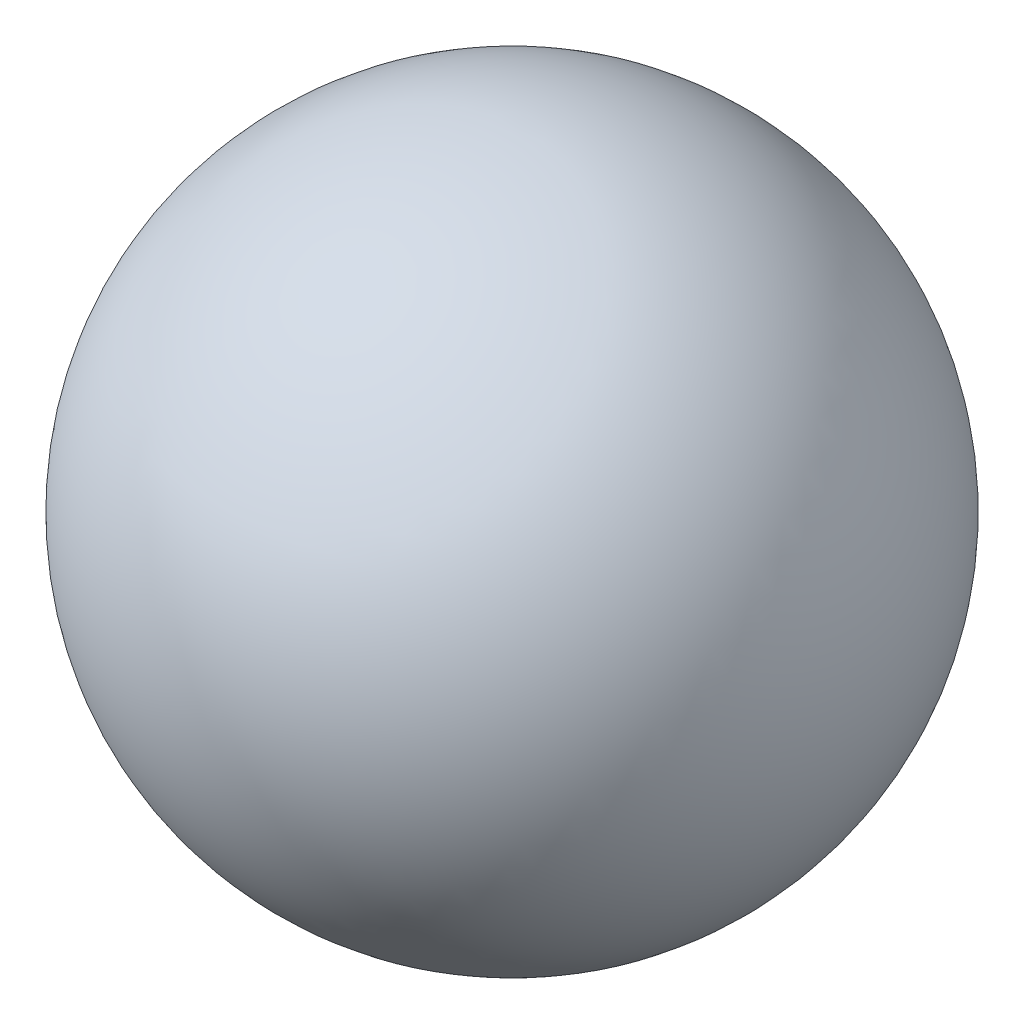
ISO-10303-21;
HEADER;
FILE_DESCRIPTION(('STEP AP214'),'2;1');
FILE_NAME('part.step','',(''),(''),'','','');
FILE_SCHEMA(('AUTOMOTIVE_DESIGN { 1 0 10303 214 1 1 1 1 }'));
ENDSEC;
DATA;
#1=APPLICATION_CONTEXT('core data for automotive mechanical design processes');
#2=APPLICATION_PROTOCOL_DEFINITION('international standard','automotive_design',2000,#1);
#3=PRODUCT_CONTEXT('',#1,'mechanical');
#4=PRODUCT('Part','Part','',(#3));
#5=PRODUCT_RELATED_PRODUCT_CATEGORY('part','',(#4));
#6=PRODUCT_DEFINITION_FORMATION('','',#4);
#7=PRODUCT_DEFINITION_CONTEXT('part definition',#1,'design');
#8=PRODUCT_DEFINITION('design','',#6,#7);
#9=PRODUCT_DEFINITION_SHAPE('','',#8);
#10=(LENGTH_UNIT() NAMED_UNIT(*) SI_UNIT(.MILLI.,.METRE.));
#11=(NAMED_UNIT(*) PLANE_ANGLE_UNIT() SI_UNIT($,.RADIAN.));
#12=(NAMED_UNIT(*) SI_UNIT($,.STERADIAN.) SOLID_ANGLE_UNIT());
#13=UNCERTAINTY_MEASURE_WITH_UNIT(LENGTH_MEASURE(1.E-05),#10,'distance_accuracy_value','');
#14=(GEOMETRIC_REPRESENTATION_CONTEXT(3) GLOBAL_UNCERTAINTY_ASSIGNED_CONTEXT((#13)) GLOBAL_UNIT_ASSIGNED_CONTEXT((#10,
#11,#12)) REPRESENTATION_CONTEXT('',''));
#15=CARTESIAN_POINT('',(0.,0.,0.));
#16=DIRECTION('',(0.,0.,1.));
#17=DIRECTION('',(1.,0.,0.));
#18=AXIS2_PLACEMENT_3D('',#15,#16,#17);
#19=CARTESIAN_POINT('',(58.75,0.,0.));
#20=DIRECTION('',(0.,1.,0.));
#21=DIRECTION('',(1.,0.,0.));
#22=AXIS2_PLACEMENT_3D('',#19,#20,#21);
#23=SPHERICAL_SURFACE('',#22,14.);
#24=CARTESIAN_POINT('',(58.75,14.,0.));
#25=VERTEX_POINT('',#24);
#26=VERTEX_LOOP('',#25);
#27=FACE_BOUND('',#26,.T.);
#28=ADVANCED_FACE('F30',(#27),#23,.T.);
#29=CLOSED_SHELL('',(#28));
#30=MANIFOLD_SOLID_BREP('B2',#29);
#31=ADVANCED_BREP_SHAPE_REPRESENTATION('',(#18,#30),#14);
#32=SHAPE_DEFINITION_REPRESENTATION(#9,#31);
ENDSEC;
END-ISO-10303-21;
